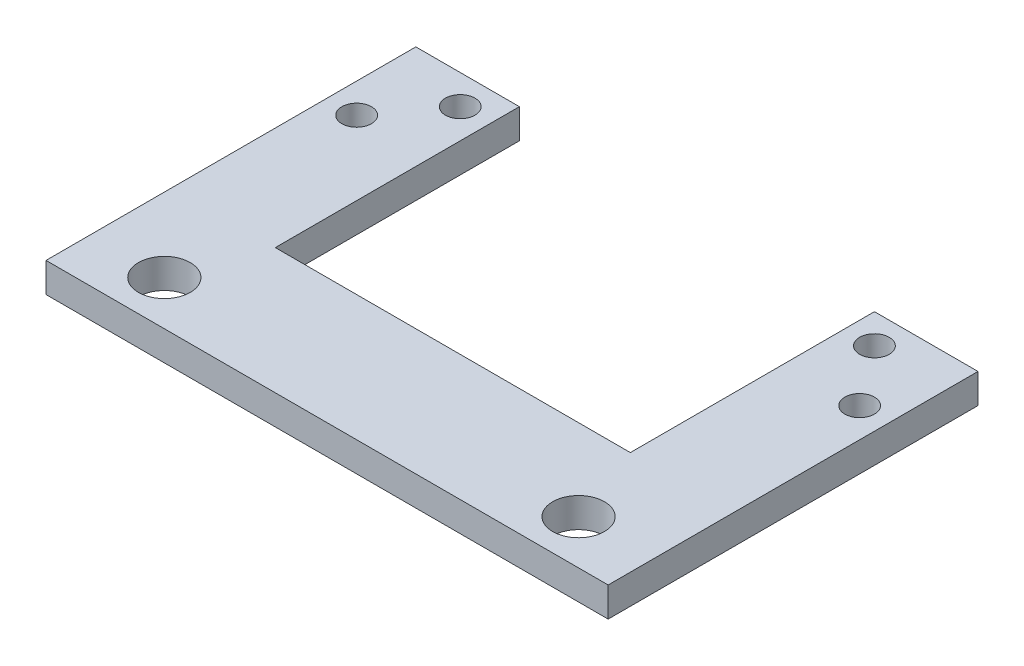
ISO-10303-21;
HEADER;
FILE_DESCRIPTION(('STEP AP214'),'2;1');
FILE_NAME('part.step','',(''),(''),'','','');
FILE_SCHEMA(('AUTOMOTIVE_DESIGN { 1 0 10303 214 1 1 1 1 }'));
ENDSEC;
DATA;
#1=APPLICATION_CONTEXT('core data for automotive mechanical design processes');
#2=APPLICATION_PROTOCOL_DEFINITION('international standard','automotive_design',2000,#1);
#3=PRODUCT_CONTEXT('',#1,'mechanical');
#4=PRODUCT('Part','Part','',(#3));
#5=PRODUCT_RELATED_PRODUCT_CATEGORY('part','',(#4));
#6=PRODUCT_DEFINITION_FORMATION('','',#4);
#7=PRODUCT_DEFINITION_CONTEXT('part definition',#1,'design');
#8=PRODUCT_DEFINITION('design','',#6,#7);
#9=PRODUCT_DEFINITION_SHAPE('','',#8);
#10=(LENGTH_UNIT() NAMED_UNIT(*) SI_UNIT(.MILLI.,.METRE.));
#11=(NAMED_UNIT(*) PLANE_ANGLE_UNIT() SI_UNIT($,.RADIAN.));
#12=(NAMED_UNIT(*) SI_UNIT($,.STERADIAN.) SOLID_ANGLE_UNIT());
#13=UNCERTAINTY_MEASURE_WITH_UNIT(LENGTH_MEASURE(1.E-05),#10,'distance_accuracy_value','');
#14=(GEOMETRIC_REPRESENTATION_CONTEXT(3) GLOBAL_UNCERTAINTY_ASSIGNED_CONTEXT((#13)) GLOBAL_UNIT_ASSIGNED_CONTEXT((#10,
#11,#12)) REPRESENTATION_CONTEXT('',''));
#15=CARTESIAN_POINT('',(0.,0.,0.));
#16=DIRECTION('',(0.,0.,1.));
#17=DIRECTION('',(1.,0.,0.));
#18=AXIS2_PLACEMENT_3D('',#15,#16,#17);
#19=CARTESIAN_POINT('',(0.,0.,0.));
#20=DIRECTION('',(0.,-1.,0.));
#21=DIRECTION('',(0.,0.,-1.));
#22=AXIS2_PLACEMENT_3D('',#19,#20,#21);
#23=PLANE('',#22);
#24=CARTESIAN_POINT('',(104.775,0.,-9.52500000000003));
#25=DIRECTION('',(0.,-1.,0.));
#26=DIRECTION('',(0.,0.,-1.));
#27=AXIS2_PLACEMENT_3D('',#24,#25,#26);
#28=CIRCLE('',#27,5.55625);
#29=CARTESIAN_POINT('',(104.775,0.,-15.08125));
#30=VERTEX_POINT('',#29);
#31=EDGE_CURVE('E120',#30,#30,#28,.F.);
#32=ORIENTED_EDGE('',*,*,#31,.T.);
#33=EDGE_LOOP('',(#32));
#34=FACE_BOUND('',#33,.T.);
#35=CARTESIAN_POINT('',(104.775,0.,-73.025));
#36=DIRECTION('',(0.,-1.,0.));
#37=DIRECTION('',(0.,0.,-1.));
#38=AXIS2_PLACEMENT_3D('',#35,#36,#37);
#39=CIRCLE('',#38,3.175);
#40=CARTESIAN_POINT('',(104.775,0.,-76.2));
#41=VERTEX_POINT('',#40);
#42=EDGE_CURVE('E126',#41,#41,#39,.F.);
#43=ORIENTED_EDGE('',*,*,#42,.T.);
#44=EDGE_LOOP('',(#43));
#45=FACE_BOUND('',#44,.T.);
#46=CARTESIAN_POINT('',(114.3,0.,-60.325));
#47=DIRECTION('',(0.,-1.,0.));
#48=DIRECTION('',(0.,0.,-1.));
#49=AXIS2_PLACEMENT_3D('',#46,#47,#48);
#50=CIRCLE('',#49,3.175);
#51=CARTESIAN_POINT('',(114.3,0.,-63.5));
#52=VERTEX_POINT('',#51);
#53=EDGE_CURVE('E131',#52,#52,#50,.F.);
#54=ORIENTED_EDGE('',*,*,#53,.T.);
#55=EDGE_LOOP('',(#54));
#56=FACE_BOUND('',#55,.T.);
#57=DIRECTION('',(0.,0.,1.));
#58=VECTOR('',#57,1.);
#59=CARTESIAN_POINT('',(120.65,0.,0.));
#60=LINE('',#59,#58);
#61=CARTESIAN_POINT('',(120.65,0.,-79.375));
#62=VERTEX_POINT('',#61);
#63=CARTESIAN_POINT('',(120.65,0.,0.));
#64=VERTEX_POINT('',#63);
#65=EDGE_CURVE('E149',#62,#64,#60,.T.);
#66=ORIENTED_EDGE('',*,*,#65,.T.);
#67=DIRECTION('',(-1.,0.,0.));
#68=VECTOR('',#67,1.);
#69=CARTESIAN_POINT('',(0.,0.,0.));
#70=LINE('',#69,#68);
#71=CARTESIAN_POINT('',(0.,0.,0.));
#72=VERTEX_POINT('',#71);
#73=EDGE_CURVE('E144',#64,#72,#70,.T.);
#74=ORIENTED_EDGE('',*,*,#73,.T.);
#75=DIRECTION('',(0.,0.,-1.));
#76=VECTOR('',#75,1.);
#77=CARTESIAN_POINT('',(0.,0.,0.));
#78=LINE('',#77,#76);
#79=CARTESIAN_POINT('',(0.,0.,-79.375));
#80=VERTEX_POINT('',#79);
#81=EDGE_CURVE('E85',#72,#80,#78,.T.);
#82=ORIENTED_EDGE('',*,*,#81,.T.);
#83=DIRECTION('',(1.,0.,0.));
#84=VECTOR('',#83,1.);
#85=CARTESIAN_POINT('',(0.,0.,-79.375));
#86=LINE('',#85,#84);
#87=CARTESIAN_POINT('',(22.225,0.,-79.375));
#88=VERTEX_POINT('',#87);
#89=EDGE_CURVE('E83',#80,#88,#86,.T.);
#90=ORIENTED_EDGE('',*,*,#89,.T.);
#91=DIRECTION('',(0.,0.,1.));
#92=VECTOR('',#91,1.);
#93=CARTESIAN_POINT('',(22.225,0.,-79.375));
#94=LINE('',#93,#92);
#95=CARTESIAN_POINT('',(22.225,0.,-26.9875));
#96=VERTEX_POINT('',#95);
#97=EDGE_CURVE('E80',#88,#96,#94,.T.);
#98=ORIENTED_EDGE('',*,*,#97,.T.);
#99=DIRECTION('',(1.,0.,0.));
#100=VECTOR('',#99,1.);
#101=CARTESIAN_POINT('',(22.225,0.,-26.9875));
#102=LINE('',#101,#100);
#103=CARTESIAN_POINT('',(98.425,0.,-26.9875));
#104=VERTEX_POINT('',#103);
#105=EDGE_CURVE('E164',#96,#104,#102,.T.);
#106=ORIENTED_EDGE('',*,*,#105,.T.);
#107=DIRECTION('',(0.,0.,-1.));
#108=VECTOR('',#107,1.);
#109=CARTESIAN_POINT('',(98.425,0.,-79.375));
#110=LINE('',#109,#108);
#111=CARTESIAN_POINT('',(98.425,0.,-79.375));
#112=VERTEX_POINT('',#111);
#113=EDGE_CURVE('E159',#104,#112,#110,.T.);
#114=ORIENTED_EDGE('',*,*,#113,.T.);
#115=DIRECTION('',(1.,0.,0.));
#116=VECTOR('',#115,1.);
#117=CARTESIAN_POINT('',(98.425,0.,-79.375));
#118=LINE('',#117,#116);
#119=EDGE_CURVE('E154',#112,#62,#118,.T.);
#120=ORIENTED_EDGE('',*,*,#119,.T.);
#121=EDGE_LOOP('',(#66,#74,#82,#90,#98,#106,#114,#120));
#122=FACE_BOUND('',#121,.T.);
#123=CARTESIAN_POINT('',(6.35,0.,-60.325));
#124=DIRECTION('',(0.,-1.,0.));
#125=DIRECTION('',(0.,0.,-1.));
#126=AXIS2_PLACEMENT_3D('',#123,#124,#125);
#127=CIRCLE('',#126,3.175);
#128=CARTESIAN_POINT('',(6.35,0.,-63.5));
#129=VERTEX_POINT('',#128);
#130=EDGE_CURVE('E20',#129,#129,#127,.F.);
#131=ORIENTED_EDGE('',*,*,#130,.T.);
#132=EDGE_LOOP('',(#131));
#133=FACE_BOUND('',#132,.T.);
#134=CARTESIAN_POINT('',(15.875,0.,-73.025));
#135=DIRECTION('',(0.,-1.,0.));
#136=DIRECTION('',(0.,0.,-1.));
#137=AXIS2_PLACEMENT_3D('',#134,#135,#136);
#138=CIRCLE('',#137,3.17500000000001);
#139=CARTESIAN_POINT('',(15.875,0.,-76.2));
#140=VERTEX_POINT('',#139);
#141=EDGE_CURVE('E129',#140,#140,#138,.F.);
#142=ORIENTED_EDGE('',*,*,#141,.T.);
#143=EDGE_LOOP('',(#142));
#144=FACE_BOUND('',#143,.T.);
#145=CARTESIAN_POINT('',(15.875,0.,-9.525));
#146=DIRECTION('',(0.,-1.,0.));
#147=DIRECTION('',(0.,0.,-1.));
#148=AXIS2_PLACEMENT_3D('',#145,#146,#147);
#149=CIRCLE('',#148,5.55625);
#150=CARTESIAN_POINT('',(15.875,0.,-15.08125));
#151=VERTEX_POINT('',#150);
#152=EDGE_CURVE('E123',#151,#151,#149,.F.);
#153=ORIENTED_EDGE('',*,*,#152,.T.);
#154=EDGE_LOOP('',(#153));
#155=FACE_BOUND('',#154,.T.);
#156=ADVANCED_FACE('F17',(#34,#45,#56,#122,#133,#144,#155),#23,.T.);
#157=CARTESIAN_POINT('',(0.,6.35,-79.375));
#158=DIRECTION('',(0.,0.,1.));
#159=DIRECTION('',(1.,0.,0.));
#160=AXIS2_PLACEMENT_3D('',#157,#158,#159);
#161=PLANE('',#160);
#162=DIRECTION('',(0.,1.,0.));
#163=VECTOR('',#162,1.);
#164=CARTESIAN_POINT('',(0.,6.35,-79.375));
#165=LINE('',#164,#163);
#166=CARTESIAN_POINT('',(0.,6.35,-79.375));
#167=VERTEX_POINT('',#166);
#168=EDGE_CURVE('E138',#80,#167,#165,.T.);
#169=ORIENTED_EDGE('',*,*,#168,.T.);
#170=DIRECTION('',(1.,0.,0.));
#171=VECTOR('',#170,1.);
#172=CARTESIAN_POINT('',(0.,6.35,-79.375));
#173=LINE('',#172,#171);
#174=CARTESIAN_POINT('',(22.225,6.35,-79.375));
#175=VERTEX_POINT('',#174);
#176=EDGE_CURVE('E101',#167,#175,#173,.T.);
#177=ORIENTED_EDGE('',*,*,#176,.T.);
#178=DIRECTION('',(0.,1.,0.));
#179=VECTOR('',#178,1.);
#180=CARTESIAN_POINT('',(22.225,6.35,-79.375));
#181=LINE('',#180,#179);
#182=EDGE_CURVE('E90',#175,#88,#181,.F.);
#183=ORIENTED_EDGE('',*,*,#182,.T.);
#184=ORIENTED_EDGE('',*,*,#89,.F.);
#185=EDGE_LOOP('',(#169,#177,#183,#184));
#186=FACE_BOUND('',#185,.T.);
#187=ADVANCED_FACE('F100',(#186),#161,.F.);
#188=CARTESIAN_POINT('',(22.225,6.35,-79.375));
#189=DIRECTION('',(-1.,0.,0.));
#190=DIRECTION('',(0.,0.,1.));
#191=AXIS2_PLACEMENT_3D('',#188,#189,#190);
#192=PLANE('',#191);
#193=ORIENTED_EDGE('',*,*,#182,.F.);
#194=DIRECTION('',(0.,0.,-1.));
#195=VECTOR('',#194,1.);
#196=CARTESIAN_POINT('',(22.225,6.35,0.));
#197=LINE('',#196,#195);
#198=CARTESIAN_POINT('',(22.225,6.35,-26.9875));
#199=VERTEX_POINT('',#198);
#200=EDGE_CURVE('E178',#175,#199,#197,.F.);
#201=ORIENTED_EDGE('',*,*,#200,.T.);
#202=DIRECTION('',(0.,1.,0.));
#203=VECTOR('',#202,1.);
#204=CARTESIAN_POINT('',(22.225,6.35,-26.9875));
#205=LINE('',#204,#203);
#206=EDGE_CURVE('E97',#199,#96,#205,.F.);
#207=ORIENTED_EDGE('',*,*,#206,.T.);
#208=ORIENTED_EDGE('',*,*,#97,.F.);
#209=EDGE_LOOP('',(#193,#201,#207,#208));
#210=FACE_BOUND('',#209,.T.);
#211=ADVANCED_FACE('F94',(#210),#192,.F.);
#212=CARTESIAN_POINT('',(22.225,6.35,-26.9875));
#213=DIRECTION('',(0.,0.,1.));
#214=DIRECTION('',(1.,0.,0.));
#215=AXIS2_PLACEMENT_3D('',#212,#213,#214);
#216=PLANE('',#215);
#217=ORIENTED_EDGE('',*,*,#206,.F.);
#218=DIRECTION('',(1.,0.,0.));
#219=VECTOR('',#218,1.);
#220=CARTESIAN_POINT('',(0.,6.35,-26.9875));
#221=LINE('',#220,#219);
#222=CARTESIAN_POINT('',(98.425,6.35,-26.9875));
#223=VERTEX_POINT('',#222);
#224=EDGE_CURVE('E175',#199,#223,#221,.T.);
#225=ORIENTED_EDGE('',*,*,#224,.T.);
#226=DIRECTION('',(0.,1.,0.));
#227=VECTOR('',#226,1.);
#228=CARTESIAN_POINT('',(98.425,6.35,-26.9875));
#229=LINE('',#228,#227);
#230=EDGE_CURVE('E161',#223,#104,#229,.F.);
#231=ORIENTED_EDGE('',*,*,#230,.T.);
#232=ORIENTED_EDGE('',*,*,#105,.F.);
#233=EDGE_LOOP('',(#217,#225,#231,#232));
#234=FACE_BOUND('',#233,.T.);
#235=ADVANCED_FACE('F173',(#234),#216,.F.);
#236=CARTESIAN_POINT('',(98.425,6.35,-79.375));
#237=DIRECTION('',(1.,0.,0.));
#238=DIRECTION('',(0.,0.,-1.));
#239=AXIS2_PLACEMENT_3D('',#236,#237,#238);
#240=PLANE('',#239);
#241=ORIENTED_EDGE('',*,*,#230,.F.);
#242=DIRECTION('',(0.,0.,-1.));
#243=VECTOR('',#242,1.);
#244=CARTESIAN_POINT('',(98.425,6.35,0.));
#245=LINE('',#244,#243);
#246=CARTESIAN_POINT('',(98.425,6.35,-79.375));
#247=VERTEX_POINT('',#246);
#248=EDGE_CURVE('E177',#223,#247,#245,.T.);
#249=ORIENTED_EDGE('',*,*,#248,.T.);
#250=DIRECTION('',(0.,1.,0.));
#251=VECTOR('',#250,1.);
#252=CARTESIAN_POINT('',(98.425,6.35,-79.375));
#253=LINE('',#252,#251);
#254=EDGE_CURVE('E156',#247,#112,#253,.F.);
#255=ORIENTED_EDGE('',*,*,#254,.T.);
#256=ORIENTED_EDGE('',*,*,#113,.F.);
#257=EDGE_LOOP('',(#241,#249,#255,#256));
#258=FACE_BOUND('',#257,.T.);
#259=ADVANCED_FACE('F169',(#258),#240,.F.);
#260=CARTESIAN_POINT('',(98.425,6.35,-79.375));
#261=DIRECTION('',(0.,0.,1.));
#262=DIRECTION('',(1.,0.,0.));
#263=AXIS2_PLACEMENT_3D('',#260,#261,#262);
#264=PLANE('',#263);
#265=ORIENTED_EDGE('',*,*,#254,.F.);
#266=DIRECTION('',(1.,0.,0.));
#267=VECTOR('',#266,1.);
#268=CARTESIAN_POINT('',(0.,6.35,-79.375));
#269=LINE('',#268,#267);
#270=CARTESIAN_POINT('',(120.65,6.35,-79.375));
#271=VERTEX_POINT('',#270);
#272=EDGE_CURVE('E180',#247,#271,#269,.T.);
#273=ORIENTED_EDGE('',*,*,#272,.T.);
#274=DIRECTION('',(0.,1.,0.));
#275=VECTOR('',#274,1.);
#276=CARTESIAN_POINT('',(120.65,6.35,-79.375));
#277=LINE('',#276,#275);
#278=EDGE_CURVE('E151',#271,#62,#277,.F.);
#279=ORIENTED_EDGE('',*,*,#278,.T.);
#280=ORIENTED_EDGE('',*,*,#119,.F.);
#281=EDGE_LOOP('',(#265,#273,#279,#280));
#282=FACE_BOUND('',#281,.T.);
#283=ADVANCED_FACE('F203',(#282),#264,.F.);
#284=CARTESIAN_POINT('',(120.65,6.35,0.));
#285=DIRECTION('',(-1.,0.,0.));
#286=DIRECTION('',(0.,0.,1.));
#287=AXIS2_PLACEMENT_3D('',#284,#285,#286);
#288=PLANE('',#287);
#289=ORIENTED_EDGE('',*,*,#278,.F.);
#290=DIRECTION('',(0.,0.,-1.));
#291=VECTOR('',#290,1.);
#292=CARTESIAN_POINT('',(120.65,6.35,0.));
#293=LINE('',#292,#291);
#294=CARTESIAN_POINT('',(120.65,6.35,0.));
#295=VERTEX_POINT('',#294);
#296=EDGE_CURVE('E185',#271,#295,#293,.F.);
#297=ORIENTED_EDGE('',*,*,#296,.T.);
#298=DIRECTION('',(0.,1.,0.));
#299=VECTOR('',#298,1.);
#300=CARTESIAN_POINT('',(120.65,6.35,0.));
#301=LINE('',#300,#299);
#302=EDGE_CURVE('E146',#295,#64,#301,.F.);
#303=ORIENTED_EDGE('',*,*,#302,.T.);
#304=ORIENTED_EDGE('',*,*,#65,.F.);
#305=EDGE_LOOP('',(#289,#297,#303,#304));
#306=FACE_BOUND('',#305,.T.);
#307=ADVANCED_FACE('F200',(#306),#288,.F.);
#308=CARTESIAN_POINT('',(0.,6.35,0.));
#309=DIRECTION('',(0.,0.,-1.));
#310=DIRECTION('',(-1.,0.,0.));
#311=AXIS2_PLACEMENT_3D('',#308,#309,#310);
#312=PLANE('',#311);
#313=ORIENTED_EDGE('',*,*,#302,.F.);
#314=DIRECTION('',(1.,0.,0.));
#315=VECTOR('',#314,1.);
#316=CARTESIAN_POINT('',(0.,6.35,0.));
#317=LINE('',#316,#315);
#318=CARTESIAN_POINT('',(0.,6.35,0.));
#319=VERTEX_POINT('',#318);
#320=EDGE_CURVE('E188',#295,#319,#317,.F.);
#321=ORIENTED_EDGE('',*,*,#320,.T.);
#322=DIRECTION('',(0.,1.,0.));
#323=VECTOR('',#322,1.);
#324=CARTESIAN_POINT('',(0.,6.35,0.));
#325=LINE('',#324,#323);
#326=EDGE_CURVE('E35',#319,#72,#325,.F.);
#327=ORIENTED_EDGE('',*,*,#326,.T.);
#328=ORIENTED_EDGE('',*,*,#73,.F.);
#329=EDGE_LOOP('',(#313,#321,#327,#328));
#330=FACE_BOUND('',#329,.T.);
#331=ADVANCED_FACE('F196',(#330),#312,.F.);
#332=CARTESIAN_POINT('',(0.,6.35,0.));
#333=DIRECTION('',(1.,0.,0.));
#334=DIRECTION('',(0.,0.,-1.));
#335=AXIS2_PLACEMENT_3D('',#332,#333,#334);
#336=PLANE('',#335);
#337=ORIENTED_EDGE('',*,*,#326,.F.);
#338=DIRECTION('',(0.,0.,-1.));
#339=VECTOR('',#338,1.);
#340=CARTESIAN_POINT('',(0.,6.35,0.));
#341=LINE('',#340,#339);
#342=EDGE_CURVE('E119',#319,#167,#341,.T.);
#343=ORIENTED_EDGE('',*,*,#342,.T.);
#344=ORIENTED_EDGE('',*,*,#168,.F.);
#345=ORIENTED_EDGE('',*,*,#81,.F.);
#346=EDGE_LOOP('',(#337,#343,#344,#345));
#347=FACE_BOUND('',#346,.T.);
#348=ADVANCED_FACE('F191',(#347),#336,.F.);
#349=CARTESIAN_POINT('',(6.35,6.35,-60.325));
#350=DIRECTION('',(0.,-1.,0.));
#351=DIRECTION('',(0.,0.,-1.));
#352=AXIS2_PLACEMENT_3D('',#349,#350,#351);
#353=CYLINDRICAL_SURFACE('',#352,3.175);
#354=ORIENTED_EDGE('',*,*,#130,.F.);
#355=EDGE_LOOP('',(#354));
#356=FACE_BOUND('',#355,.T.);
#357=CARTESIAN_POINT('',(6.35,6.35,-60.325));
#358=DIRECTION('',(0.,-1.,0.));
#359=DIRECTION('',(0.,0.,-1.));
#360=AXIS2_PLACEMENT_3D('',#357,#358,#359);
#361=CIRCLE('',#360,3.175);
#362=CARTESIAN_POINT('',(6.35,6.35,-63.5));
#363=VERTEX_POINT('',#362);
#364=EDGE_CURVE('E116',#363,#363,#361,.F.);
#365=ORIENTED_EDGE('',*,*,#364,.T.);
#366=EDGE_LOOP('',(#365));
#367=FACE_BOUND('',#366,.T.);
#368=ADVANCED_FACE('F240',(#356,#367),#353,.F.);
#369=CARTESIAN_POINT('',(114.3,6.35,-60.325));
#370=DIRECTION('',(0.,-1.,0.));
#371=DIRECTION('',(0.,0.,-1.));
#372=AXIS2_PLACEMENT_3D('',#369,#370,#371);
#373=CYLINDRICAL_SURFACE('',#372,3.175);
#374=ORIENTED_EDGE('',*,*,#53,.F.);
#375=EDGE_LOOP('',(#374));
#376=FACE_BOUND('',#375,.T.);
#377=CARTESIAN_POINT('',(114.3,6.35,-60.325));
#378=DIRECTION('',(0.,-1.,0.));
#379=DIRECTION('',(0.,0.,-1.));
#380=AXIS2_PLACEMENT_3D('',#377,#378,#379);
#381=CIRCLE('',#380,3.175);
#382=CARTESIAN_POINT('',(114.3,6.35,-63.5));
#383=VERTEX_POINT('',#382);
#384=EDGE_CURVE('E113',#383,#383,#381,.F.);
#385=ORIENTED_EDGE('',*,*,#384,.T.);
#386=EDGE_LOOP('',(#385));
#387=FACE_BOUND('',#386,.T.);
#388=ADVANCED_FACE('F236',(#376,#387),#373,.F.);
#389=CARTESIAN_POINT('',(15.875,6.35,-73.025));
#390=DIRECTION('',(0.,-1.,0.));
#391=DIRECTION('',(0.,0.,-1.));
#392=AXIS2_PLACEMENT_3D('',#389,#390,#391);
#393=CYLINDRICAL_SURFACE('',#392,3.17500000000001);
#394=ORIENTED_EDGE('',*,*,#141,.F.);
#395=EDGE_LOOP('',(#394));
#396=FACE_BOUND('',#395,.T.);
#397=CARTESIAN_POINT('',(15.875,6.35,-73.025));
#398=DIRECTION('',(0.,-1.,0.));
#399=DIRECTION('',(0.,0.,-1.));
#400=AXIS2_PLACEMENT_3D('',#397,#398,#399);
#401=CIRCLE('',#400,3.17500000000001);
#402=CARTESIAN_POINT('',(15.875,6.35,-76.2));
#403=VERTEX_POINT('',#402);
#404=EDGE_CURVE('E110',#403,#403,#401,.F.);
#405=ORIENTED_EDGE('',*,*,#404,.T.);
#406=EDGE_LOOP('',(#405));
#407=FACE_BOUND('',#406,.T.);
#408=ADVANCED_FACE('F232',(#396,#407),#393,.F.);
#409=CARTESIAN_POINT('',(104.775,6.35,-73.025));
#410=DIRECTION('',(0.,-1.,0.));
#411=DIRECTION('',(0.,0.,-1.));
#412=AXIS2_PLACEMENT_3D('',#409,#410,#411);
#413=CYLINDRICAL_SURFACE('',#412,3.175);
#414=ORIENTED_EDGE('',*,*,#42,.F.);
#415=EDGE_LOOP('',(#414));
#416=FACE_BOUND('',#415,.T.);
#417=CARTESIAN_POINT('',(104.775,6.35,-73.025));
#418=DIRECTION('',(0.,-1.,0.));
#419=DIRECTION('',(0.,0.,-1.));
#420=AXIS2_PLACEMENT_3D('',#417,#418,#419);
#421=CIRCLE('',#420,3.175);
#422=CARTESIAN_POINT('',(104.775,6.35,-76.2));
#423=VERTEX_POINT('',#422);
#424=EDGE_CURVE('E107',#423,#423,#421,.F.);
#425=ORIENTED_EDGE('',*,*,#424,.T.);
#426=EDGE_LOOP('',(#425));
#427=FACE_BOUND('',#426,.T.);
#428=ADVANCED_FACE('F228',(#416,#427),#413,.F.);
#429=CARTESIAN_POINT('',(15.875,6.35,-9.525));
#430=DIRECTION('',(0.,-1.,0.));
#431=DIRECTION('',(0.,0.,-1.));
#432=AXIS2_PLACEMENT_3D('',#429,#430,#431);
#433=CYLINDRICAL_SURFACE('',#432,5.55625);
#434=ORIENTED_EDGE('',*,*,#152,.F.);
#435=EDGE_LOOP('',(#434));
#436=FACE_BOUND('',#435,.T.);
#437=CARTESIAN_POINT('',(15.875,6.35,-9.525));
#438=DIRECTION('',(0.,-1.,0.));
#439=DIRECTION('',(0.,0.,-1.));
#440=AXIS2_PLACEMENT_3D('',#437,#438,#439);
#441=CIRCLE('',#440,5.55625);
#442=CARTESIAN_POINT('',(15.875,6.35,-15.08125));
#443=VERTEX_POINT('',#442);
#444=EDGE_CURVE('E26',#443,#443,#441,.F.);
#445=ORIENTED_EDGE('',*,*,#444,.T.);
#446=EDGE_LOOP('',(#445));
#447=FACE_BOUND('',#446,.T.);
#448=ADVANCED_FACE('F220',(#436,#447),#433,.F.);
#449=CARTESIAN_POINT('',(104.775,6.35,-9.52500000000003));
#450=DIRECTION('',(0.,-1.,0.));
#451=DIRECTION('',(0.,0.,-1.));
#452=AXIS2_PLACEMENT_3D('',#449,#450,#451);
#453=CYLINDRICAL_SURFACE('',#452,5.55625);
#454=ORIENTED_EDGE('',*,*,#31,.F.);
#455=EDGE_LOOP('',(#454));
#456=FACE_BOUND('',#455,.T.);
#457=CARTESIAN_POINT('',(104.775,6.35,-9.52500000000003));
#458=DIRECTION('',(0.,-1.,0.));
#459=DIRECTION('',(0.,0.,-1.));
#460=AXIS2_PLACEMENT_3D('',#457,#458,#459);
#461=CIRCLE('',#460,5.55625);
#462=CARTESIAN_POINT('',(104.775,6.35,-15.08125));
#463=VERTEX_POINT('',#462);
#464=EDGE_CURVE('E11',#463,#463,#461,.F.);
#465=ORIENTED_EDGE('',*,*,#464,.T.);
#466=EDGE_LOOP('',(#465));
#467=FACE_BOUND('',#466,.T.);
#468=ADVANCED_FACE('F214',(#456,#467),#453,.F.);
#469=CARTESIAN_POINT('',(0.,6.35,0.));
#470=DIRECTION('',(0.,-1.,0.));
#471=DIRECTION('',(0.,0.,-1.));
#472=AXIS2_PLACEMENT_3D('',#469,#470,#471);
#473=PLANE('',#472);
#474=ORIENTED_EDGE('',*,*,#464,.F.);
#475=EDGE_LOOP('',(#474));
#476=FACE_BOUND('',#475,.T.);
#477=ORIENTED_EDGE('',*,*,#444,.F.);
#478=EDGE_LOOP('',(#477));
#479=FACE_BOUND('',#478,.T.);
#480=ORIENTED_EDGE('',*,*,#424,.F.);
#481=EDGE_LOOP('',(#480));
#482=FACE_BOUND('',#481,.T.);
#483=ORIENTED_EDGE('',*,*,#404,.F.);
#484=EDGE_LOOP('',(#483));
#485=FACE_BOUND('',#484,.T.);
#486=ORIENTED_EDGE('',*,*,#384,.F.);
#487=EDGE_LOOP('',(#486));
#488=FACE_BOUND('',#487,.T.);
#489=ORIENTED_EDGE('',*,*,#364,.F.);
#490=EDGE_LOOP('',(#489));
#491=FACE_BOUND('',#490,.T.);
#492=ORIENTED_EDGE('',*,*,#320,.F.);
#493=ORIENTED_EDGE('',*,*,#296,.F.);
#494=ORIENTED_EDGE('',*,*,#272,.F.);
#495=ORIENTED_EDGE('',*,*,#248,.F.);
#496=ORIENTED_EDGE('',*,*,#224,.F.);
#497=ORIENTED_EDGE('',*,*,#200,.F.);
#498=ORIENTED_EDGE('',*,*,#176,.F.);
#499=ORIENTED_EDGE('',*,*,#342,.F.);
#500=EDGE_LOOP('',(#492,#493,#494,#495,#496,#497,#498,#499));
#501=FACE_BOUND('',#500,.T.);
#502=ADVANCED_FACE('F193',(#476,#479,#482,#485,#488,#491,#501),#473,.F.);
#503=CLOSED_SHELL('',(#156,#187,#211,#235,#259,#283,#307,#331,#348,#368,#388,#408,#428,#448,
#468,#502));
#504=MANIFOLD_SOLID_BREP('B1',#503);
#505=ADVANCED_BREP_SHAPE_REPRESENTATION('',(#18,#504),#14);
#506=SHAPE_DEFINITION_REPRESENTATION(#9,#505);
ENDSEC;
END-ISO-10303-21;
